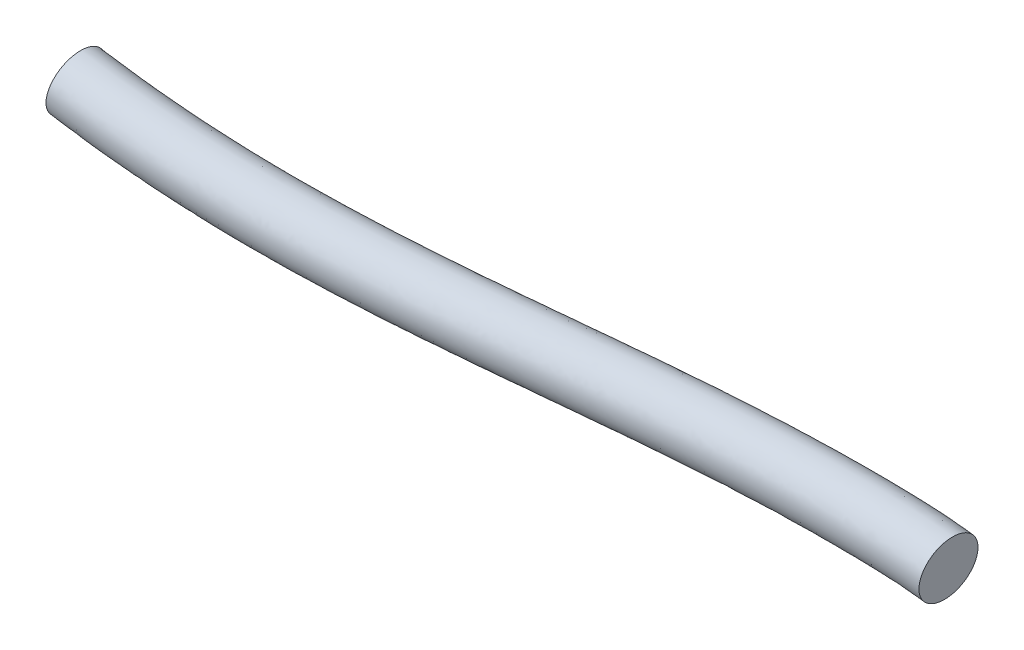
ISO-10303-21;
HEADER;
FILE_DESCRIPTION(('STEP AP214'),'2;1');
FILE_NAME('part.step','',(''),(''),'','','');
FILE_SCHEMA(('AUTOMOTIVE_DESIGN { 1 0 10303 214 1 1 1 1 }'));
ENDSEC;
DATA;
#1=APPLICATION_CONTEXT('core data for automotive mechanical design processes');
#2=APPLICATION_PROTOCOL_DEFINITION('international standard','automotive_design',2000,#1);
#3=PRODUCT_CONTEXT('',#1,'mechanical');
#4=PRODUCT('Part','Part','',(#3));
#5=PRODUCT_RELATED_PRODUCT_CATEGORY('part','',(#4));
#6=PRODUCT_DEFINITION_FORMATION('','',#4);
#7=PRODUCT_DEFINITION_CONTEXT('part definition',#1,'design');
#8=PRODUCT_DEFINITION('design','',#6,#7);
#9=PRODUCT_DEFINITION_SHAPE('','',#8);
#10=(LENGTH_UNIT() NAMED_UNIT(*) SI_UNIT(.MILLI.,.METRE.));
#11=(NAMED_UNIT(*) PLANE_ANGLE_UNIT() SI_UNIT($,.RADIAN.));
#12=(NAMED_UNIT(*) SI_UNIT($,.STERADIAN.) SOLID_ANGLE_UNIT());
#13=UNCERTAINTY_MEASURE_WITH_UNIT(LENGTH_MEASURE(1.E-05),#10,'distance_accuracy_value','');
#14=(GEOMETRIC_REPRESENTATION_CONTEXT(3) GLOBAL_UNCERTAINTY_ASSIGNED_CONTEXT((#13)) GLOBAL_UNIT_ASSIGNED_CONTEXT((#10,
#11,#12)) REPRESENTATION_CONTEXT('',''));
#15=CARTESIAN_POINT('',(0.,0.,0.));
#16=DIRECTION('',(0.,0.,1.));
#17=DIRECTION('',(1.,0.,0.));
#18=AXIS2_PLACEMENT_3D('',#15,#16,#17);
#19=CARTESIAN_POINT('',(-45.0248996878404,7.077953315822,0.));
#20=DIRECTION('',(0.986521990180811,-0.163628734914417,0.));
#21=DIRECTION('',(0.163628734914417,0.986521990180811,0.));
#22=AXIS2_PLACEMENT_3D('',#19,#20,#21);
#23=PLANE('',#22);
#24=CARTESIAN_POINT('',(-45.0248996878404,7.077953315822,0.));
#25=DIRECTION('',(0.986521990180811,-0.163628734914417,0.));
#26=DIRECTION('',(0.163628734914417,0.986521990180811,0.));
#27=AXIS2_PLACEMENT_3D('',#24,#25,#26);
#28=CIRCLE('',#27,2.);
#29=CARTESIAN_POINT('',(-44.6976422180116,9.05099729618362,0.));
#30=VERTEX_POINT('',#29);
#31=EDGE_CURVE('E45',#30,#30,#28,.T.);
#32=ORIENTED_EDGE('',*,*,#31,.F.);
#33=EDGE_LOOP('',(#32));
#34=FACE_BOUND('',#33,.T.);
#35=ADVANCED_FACE('F38',(#34),#23,.F.);
#36=CARTESIAN_POINT('',(14.5423274305472,8.07810534186615,0.));
#37=DIRECTION('',(0.991012131899101,-0.133772024088744,0.));
#38=DIRECTION('',(0.133772024088744,0.991012131899101,0.));
#39=AXIS2_PLACEMENT_3D('',#36,#37,#38);
#40=PLANE('',#39);
#41=CARTESIAN_POINT('',(14.5423274305472,8.07810534186615,0.));
#42=DIRECTION('',(0.991012131899101,-0.133772024088744,0.));
#43=DIRECTION('',(0.133772024088744,0.991012131899101,0.));
#44=AXIS2_PLACEMENT_3D('',#41,#42,#43);
#45=CIRCLE('',#44,2.);
#46=CARTESIAN_POINT('',(14.8098714787247,10.0601296056643,0.));
#47=VERTEX_POINT('',#46);
#48=EDGE_CURVE('E12',#47,#47,#45,.T.);
#49=ORIENTED_EDGE('',*,*,#48,.T.);
#50=EDGE_LOOP('',(#49));
#51=FACE_BOUND('',#50,.T.);
#52=ADVANCED_FACE('F52',(#51),#40,.T.);
#53=CARTESIAN_POINT('',(-44.6976422180116,9.05099729618362,0.));
#54=CARTESIAN_POINT('',(-35.7941157949246,7.57422052067465,0.));
#55=CARTESIAN_POINT('',(-26.8177797363876,7.96472642441222,0.));
#56=CARTESIAN_POINT('',(-8.61870166049736,9.45357816004495,0.));
#57=CARTESIAN_POINT('',(0.59543357596289,10.5532456188728,0.));
#58=CARTESIAN_POINT('',(11.5267678505565,10.3491521843481,0.));
#59=CARTESIAN_POINT('',(13.1523883491846,10.2838653823433,0.));
#60=CARTESIAN_POINT('',(14.8098714787247,10.0601296056644,0.));
#61=CARTESIAN_POINT('',(-44.6976422180116,9.05099729618362,4.));
#62=CARTESIAN_POINT('',(-35.7941157949246,7.57422052067465,4.));
#63=CARTESIAN_POINT('',(-26.8177797363876,7.96472642441222,4.));
#64=CARTESIAN_POINT('',(-8.61870166049736,9.45357816004495,4.));
#65=CARTESIAN_POINT('',(0.59543357596289,10.5532456188728,4.));
#66=CARTESIAN_POINT('',(11.5267678505565,10.3491521843481,4.));
#67=CARTESIAN_POINT('',(13.1523883491846,10.2838653823433,4.));
#68=CARTESIAN_POINT('',(14.8098714787247,10.0601296056644,4.));
#69=CARTESIAN_POINT('',(-45.3521571576693,5.10490933546038,4.));
#70=CARTESIAN_POINT('',(-35.9103921595582,3.53885801989437,4.));
#71=CARTESIAN_POINT('',(-26.5890606901629,3.9700745795063,4.));
#72=CARTESIAN_POINT('',(-8.19512640914973,5.47486734235019,4.));
#73=CARTESIAN_POINT('',(0.886083184909259,6.5471219319552,4.));
#74=CARTESIAN_POINT('',(11.3904499571291,6.35100019301398,4.));
#75=CARTESIAN_POINT('',(12.8611745630263,6.28689742067091,4.));
#76=CARTESIAN_POINT('',(14.2747833823697,6.09608107806795,4.));
#77=CARTESIAN_POINT('',(-45.3521571576693,5.10490933546037,0.));
#78=CARTESIAN_POINT('',(-35.9103921595582,3.53885801989437,0.));
#79=CARTESIAN_POINT('',(-26.5890606901629,3.9700745795063,0.));
#80=CARTESIAN_POINT('',(-8.19512640914973,5.47486734235019,0.));
#81=CARTESIAN_POINT('',(0.886083184909259,6.5471219319552,0.));
#82=CARTESIAN_POINT('',(11.3904499571291,6.35100019301398,0.));
#83=CARTESIAN_POINT('',(12.8611745630263,6.28689742067091,0.));
#84=CARTESIAN_POINT('',(14.2747833823697,6.09608107806795,0.));
#85=CARTESIAN_POINT('',(-45.3521571576693,5.10490933546037,-4.));
#86=CARTESIAN_POINT('',(-35.9103921595582,3.53885801989437,-4.));
#87=CARTESIAN_POINT('',(-26.5890606901629,3.9700745795063,-4.));
#88=CARTESIAN_POINT('',(-8.19512640914973,5.47486734235019,-4.));
#89=CARTESIAN_POINT('',(0.886083184909259,6.5471219319552,-4.));
#90=CARTESIAN_POINT('',(11.3904499571291,6.35100019301398,-4.));
#91=CARTESIAN_POINT('',(12.8611745630263,6.2868974206709,-4.));
#92=CARTESIAN_POINT('',(14.2747833823697,6.09608107806795,-4.));
#93=CARTESIAN_POINT('',(-44.6976422180116,9.05099729618362,-4.));
#94=CARTESIAN_POINT('',(-35.7941157949246,7.57422052067465,-4.));
#95=CARTESIAN_POINT('',(-26.8177797363876,7.96472642441222,-4.));
#96=CARTESIAN_POINT('',(-8.61870166049736,9.45357816004495,-4.));
#97=CARTESIAN_POINT('',(0.59543357596289,10.5532456188728,-4.));
#98=CARTESIAN_POINT('',(11.5267678505565,10.3491521843481,-4.));
#99=CARTESIAN_POINT('',(13.1523883491846,10.2838653823433,-4.));
#100=CARTESIAN_POINT('',(14.8098714787247,10.0601296056644,-4.));
#101=CARTESIAN_POINT('',(-44.6976422180116,9.05099729618362,0.));
#102=CARTESIAN_POINT('',(-35.7941157949246,7.57422052067465,0.));
#103=CARTESIAN_POINT('',(-26.8177797363876,7.96472642441222,0.));
#104=CARTESIAN_POINT('',(-8.61870166049736,9.45357816004495,0.));
#105=CARTESIAN_POINT('',(0.59543357596289,10.5532456188728,0.));
#106=CARTESIAN_POINT('',(11.5267678505565,10.3491521843481,0.));
#107=CARTESIAN_POINT('',(13.1523883491846,10.2838653823433,0.));
#108=CARTESIAN_POINT('',(14.8098714787247,10.0601296056644,0.));
#109=(BOUNDED_SURFACE() B_SPLINE_SURFACE(3,3,((#53,#54,#55,#56,#57,#58,#59,#60),(#61,#62,#63,
#64,#65,#66,#67,#68),(#69,#70,#71,#72,#73,#74,#75,#76),(#77,#78,#79,#80,#81,#82,#83,#84),(#85,
#86,#87,#88,#89,#90,#91,#92),(#93,#94,#95,#96,#97,#98,#99,#100),(#101,#102,#103,#104,#105,#106,
#107,#108)),.UNSPECIFIED.,.T.,.F.,.F.) B_SPLINE_SURFACE_WITH_KNOTS((4,3,4),(4,2,2,4),(0.,0.5,
1.),(0.,0.461094277737383,0.922188555474766,1.),
.UNSPECIFIED.) GEOMETRIC_REPRESENTATION_ITEM() RATIONAL_B_SPLINE_SURFACE(((1.,1.,1.,1.,1.,1.,1.,
1.),(0.333333333333333,0.333333333333333,0.333333333333333,0.333333333333333,0.333333333333333,
0.333333333333333,0.333333333333333,0.333333333333333),(0.333333333333333,0.333333333333333,
0.333333333333333,0.333333333333333,0.333333333333333,0.333333333333333,0.333333333333333,
0.333333333333333),(1.,1.,1.,1.,1.,1.,1.,1.),(0.333333333333333,0.333333333333333,
0.333333333333333,0.333333333333333,0.333333333333333,0.333333333333333,0.333333333333333,
0.333333333333333),(0.333333333333333,0.333333333333333,0.333333333333333,0.333333333333333,
0.333333333333333,0.333333333333333,0.333333333333333,0.333333333333333),(1.,1.,1.,1.,1.,1.,1.,1.))) REPRESENTATION_ITEM('') SURFACE());
#110=ORIENTED_EDGE('',*,*,#48,.F.);
#111=EDGE_LOOP('',(#110));
#112=FACE_BOUND('',#111,.T.);
#113=ORIENTED_EDGE('',*,*,#31,.T.);
#114=EDGE_LOOP('',(#113));
#115=FACE_BOUND('',#114,.T.);
#116=ADVANCED_FACE('F54',(#112,#115),#109,.T.);
#117=CLOSED_SHELL('',(#35,#52,#116));
#118=MANIFOLD_SOLID_BREP('B2',#117);
#119=ADVANCED_BREP_SHAPE_REPRESENTATION('',(#18,#118),#14);
#120=SHAPE_DEFINITION_REPRESENTATION(#9,#119);
ENDSEC;
END-ISO-10303-21;
